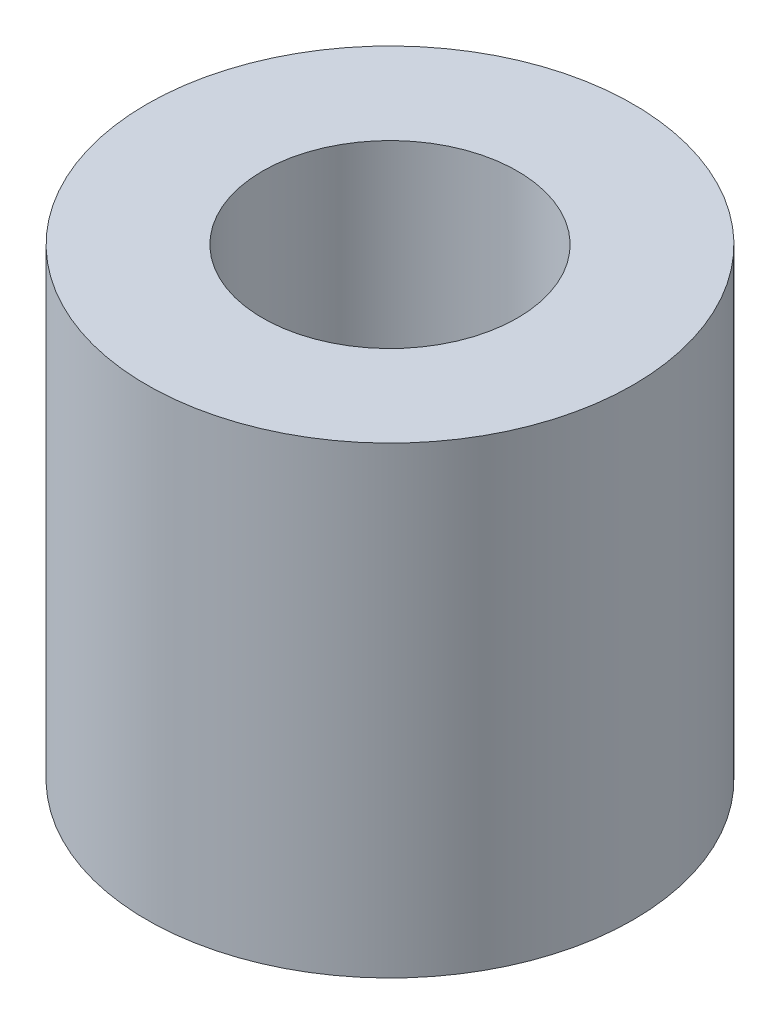
ISO-10303-21;
HEADER;
FILE_DESCRIPTION(('STEP AP214'),'2;1');
FILE_NAME('part.step','',(''),(''),'','','');
FILE_SCHEMA(('AUTOMOTIVE_DESIGN { 1 0 10303 214 1 1 1 1 }'));
ENDSEC;
DATA;
#1=APPLICATION_CONTEXT('core data for automotive mechanical design processes');
#2=APPLICATION_PROTOCOL_DEFINITION('international standard','automotive_design',2000,#1);
#3=PRODUCT_CONTEXT('',#1,'mechanical');
#4=PRODUCT('Part','Part','',(#3));
#5=PRODUCT_RELATED_PRODUCT_CATEGORY('part','',(#4));
#6=PRODUCT_DEFINITION_FORMATION('','',#4);
#7=PRODUCT_DEFINITION_CONTEXT('part definition',#1,'design');
#8=PRODUCT_DEFINITION('design','',#6,#7);
#9=PRODUCT_DEFINITION_SHAPE('','',#8);
#10=(LENGTH_UNIT() NAMED_UNIT(*) SI_UNIT(.MILLI.,.METRE.));
#11=(NAMED_UNIT(*) PLANE_ANGLE_UNIT() SI_UNIT($,.RADIAN.));
#12=(NAMED_UNIT(*) SI_UNIT($,.STERADIAN.) SOLID_ANGLE_UNIT());
#13=UNCERTAINTY_MEASURE_WITH_UNIT(LENGTH_MEASURE(1.E-05),#10,'distance_accuracy_value','');
#14=(GEOMETRIC_REPRESENTATION_CONTEXT(3) GLOBAL_UNCERTAINTY_ASSIGNED_CONTEXT((#13)) GLOBAL_UNIT_ASSIGNED_CONTEXT((#10,
#11,#12)) REPRESENTATION_CONTEXT('',''));
#15=CARTESIAN_POINT('',(0.,0.,0.));
#16=DIRECTION('',(0.,0.,1.));
#17=DIRECTION('',(1.,0.,0.));
#18=AXIS2_PLACEMENT_3D('',#15,#16,#17);
#19=CARTESIAN_POINT('',(0.,0.,0.));
#20=DIRECTION('',(0.,1.,0.));
#21=DIRECTION('',(1.,0.,0.));
#22=AXIS2_PLACEMENT_3D('',#19,#20,#21);
#23=PLANE('',#22);
#24=CARTESIAN_POINT('',(0.,0.,0.));
#25=DIRECTION('',(0.,1.,0.));
#26=DIRECTION('',(-1.,0.,0.));
#27=AXIS2_PLACEMENT_3D('',#24,#25,#26);
#28=CIRCLE('',#27,3.15);
#29=CARTESIAN_POINT('',(-3.15,0.,0.));
#30=VERTEX_POINT('',#29);
#31=EDGE_CURVE('E29',#30,#30,#28,.T.);
#32=ORIENTED_EDGE('',*,*,#31,.F.);
#33=EDGE_LOOP('',(#32));
#34=FACE_BOUND('',#33,.T.);
#35=CARTESIAN_POINT('',(0.,0.,0.));
#36=DIRECTION('',(0.,-1.,0.));
#37=DIRECTION('',(-1.,0.,0.));
#38=AXIS2_PLACEMENT_3D('',#35,#36,#37);
#39=CIRCLE('',#38,1.65);
#40=CARTESIAN_POINT('',(-1.65,0.,0.));
#41=VERTEX_POINT('',#40);
#42=EDGE_CURVE('E10',#41,#41,#39,.T.);
#43=ORIENTED_EDGE('',*,*,#42,.F.);
#44=EDGE_LOOP('',(#43));
#45=FACE_BOUND('',#44,.T.);
#46=ADVANCED_FACE('F15',(#34,#45),#23,.F.);
#47=CARTESIAN_POINT('',(0.,0.,0.));
#48=DIRECTION('',(0.,1.,0.));
#49=DIRECTION('',(1.,0.,0.));
#50=AXIS2_PLACEMENT_3D('',#47,#48,#49);
#51=CYLINDRICAL_SURFACE('',#50,1.65);
#52=CARTESIAN_POINT('',(0.,6.,0.));
#53=DIRECTION('',(0.,-1.,0.));
#54=DIRECTION('',(1.,0.,0.));
#55=AXIS2_PLACEMENT_3D('',#52,#53,#54);
#56=CIRCLE('',#55,1.65);
#57=CARTESIAN_POINT('',(1.65,6.,0.));
#58=VERTEX_POINT('',#57);
#59=EDGE_CURVE('E27',#58,#58,#56,.T.);
#60=ORIENTED_EDGE('',*,*,#59,.F.);
#61=EDGE_LOOP('',(#60));
#62=FACE_BOUND('',#61,.T.);
#63=ORIENTED_EDGE('',*,*,#42,.T.);
#64=EDGE_LOOP('',(#63));
#65=FACE_BOUND('',#64,.T.);
#66=ADVANCED_FACE('F39',(#62,#65),#51,.F.);
#67=CARTESIAN_POINT('',(0.,6.,0.));
#68=DIRECTION('',(0.,1.,0.));
#69=DIRECTION('',(1.,0.,0.));
#70=AXIS2_PLACEMENT_3D('',#67,#68,#69);
#71=PLANE('',#70);
#72=CARTESIAN_POINT('',(0.,6.,0.));
#73=DIRECTION('',(0.,1.,0.));
#74=DIRECTION('',(-1.,0.,0.));
#75=AXIS2_PLACEMENT_3D('',#72,#73,#74);
#76=CIRCLE('',#75,3.15);
#77=CARTESIAN_POINT('',(-3.15,6.,0.));
#78=VERTEX_POINT('',#77);
#79=EDGE_CURVE('E19',#78,#78,#76,.T.);
#80=ORIENTED_EDGE('',*,*,#79,.T.);
#81=EDGE_LOOP('',(#80));
#82=FACE_BOUND('',#81,.T.);
#83=ORIENTED_EDGE('',*,*,#59,.T.);
#84=EDGE_LOOP('',(#83));
#85=FACE_BOUND('',#84,.T.);
#86=ADVANCED_FACE('F45',(#82,#85),#71,.T.);
#87=CARTESIAN_POINT('',(0.,0.,0.));
#88=DIRECTION('',(0.,1.,0.));
#89=DIRECTION('',(1.,0.,0.));
#90=AXIS2_PLACEMENT_3D('',#87,#88,#89);
#91=CYLINDRICAL_SURFACE('',#90,3.15);
#92=ORIENTED_EDGE('',*,*,#79,.F.);
#93=EDGE_LOOP('',(#92));
#94=FACE_BOUND('',#93,.T.);
#95=ORIENTED_EDGE('',*,*,#31,.T.);
#96=EDGE_LOOP('',(#95));
#97=FACE_BOUND('',#96,.T.);
#98=ADVANCED_FACE('F17',(#94,#97),#91,.T.);
#99=CLOSED_SHELL('',(#46,#66,#86,#98));
#100=MANIFOLD_SOLID_BREP('B1',#99);
#101=ADVANCED_BREP_SHAPE_REPRESENTATION('',(#18,#100),#14);
#102=SHAPE_DEFINITION_REPRESENTATION(#9,#101);
ENDSEC;
END-ISO-10303-21;
